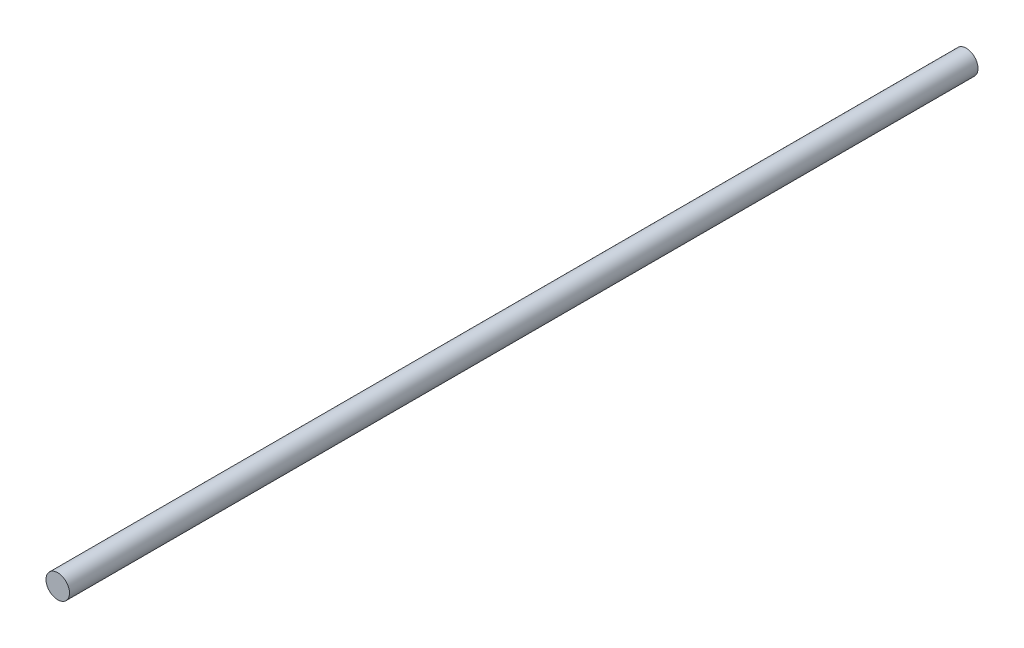
ISO-10303-21;
HEADER;
FILE_DESCRIPTION(('STEP AP214'),'2;1');
FILE_NAME('part.step','',(''),(''),'','','');
FILE_SCHEMA(('AUTOMOTIVE_DESIGN { 1 0 10303 214 1 1 1 1 }'));
ENDSEC;
DATA;
#1=APPLICATION_CONTEXT('core data for automotive mechanical design processes');
#2=APPLICATION_PROTOCOL_DEFINITION('international standard','automotive_design',2000,#1);
#3=PRODUCT_CONTEXT('',#1,'mechanical');
#4=PRODUCT('Part','Part','',(#3));
#5=PRODUCT_RELATED_PRODUCT_CATEGORY('part','',(#4));
#6=PRODUCT_DEFINITION_FORMATION('','',#4);
#7=PRODUCT_DEFINITION_CONTEXT('part definition',#1,'design');
#8=PRODUCT_DEFINITION('design','',#6,#7);
#9=PRODUCT_DEFINITION_SHAPE('','',#8);
#10=(LENGTH_UNIT() NAMED_UNIT(*) SI_UNIT(.MILLI.,.METRE.));
#11=(NAMED_UNIT(*) PLANE_ANGLE_UNIT() SI_UNIT($,.RADIAN.));
#12=(NAMED_UNIT(*) SI_UNIT($,.STERADIAN.) SOLID_ANGLE_UNIT());
#13=UNCERTAINTY_MEASURE_WITH_UNIT(LENGTH_MEASURE(1.E-05),#10,'distance_accuracy_value','');
#14=(GEOMETRIC_REPRESENTATION_CONTEXT(3) GLOBAL_UNCERTAINTY_ASSIGNED_CONTEXT((#13)) GLOBAL_UNIT_ASSIGNED_CONTEXT((#10,
#11,#12)) REPRESENTATION_CONTEXT('',''));
#15=CARTESIAN_POINT('',(0.,0.,0.));
#16=DIRECTION('',(0.,0.,1.));
#17=DIRECTION('',(1.,0.,0.));
#18=AXIS2_PLACEMENT_3D('',#15,#16,#17);
#19=CARTESIAN_POINT('',(0.,0.,232.));
#20=DIRECTION('',(0.,0.,-1.));
#21=DIRECTION('',(-1.,0.,0.));
#22=AXIS2_PLACEMENT_3D('',#19,#20,#21);
#23=CYLINDRICAL_SURFACE('',#22,3.);
#24=CARTESIAN_POINT('',(0.,0.,232.));
#25=DIRECTION('',(0.,0.,1.));
#26=DIRECTION('',(1.,0.,0.));
#27=AXIS2_PLACEMENT_3D('',#24,#25,#26);
#28=CIRCLE('',#27,3.);
#29=CARTESIAN_POINT('',(-3.,0.,232.));
#30=VERTEX_POINT('',#29);
#31=EDGE_CURVE('E10',#30,#30,#28,.T.);
#32=CARTESIAN_POINT('',(0.,0.,0.));
#33=DIRECTION('',(0.,0.,1.));
#34=DIRECTION('',(1.,0.,0.));
#35=AXIS2_PLACEMENT_3D('',#32,#33,#34);
#36=CIRCLE('',#35,3.);
#37=CARTESIAN_POINT('',(-3.,0.,0.));
#38=VERTEX_POINT('',#37);
#39=EDGE_CURVE('E36',#38,#38,#36,.T.);
#40=CARTESIAN_POINT('',(-3.,0.,232.));
#41=CARTESIAN_POINT('',(-3.,0.,229.583333333333));
#42=CARTESIAN_POINT('',(-3.,0.,227.166666666667));
#43=CARTESIAN_POINT('',(-3.,0.,222.333333333333));
#44=CARTESIAN_POINT('',(-3.,0.,219.916666666667));
#45=CARTESIAN_POINT('',(-3.,0.,215.083333333333));
#46=CARTESIAN_POINT('',(-3.,0.,212.666666666667));
#47=CARTESIAN_POINT('',(-3.,0.,207.833333333333));
#48=CARTESIAN_POINT('',(-3.,0.,205.416666666667));
#49=CARTESIAN_POINT('',(-3.,0.,200.583333333333));
#50=CARTESIAN_POINT('',(-3.,0.,198.166666666667));
#51=CARTESIAN_POINT('',(-3.,0.,193.333333333333));
#52=CARTESIAN_POINT('',(-3.,0.,190.916666666667));
#53=CARTESIAN_POINT('',(-3.,0.,186.083333333333));
#54=CARTESIAN_POINT('',(-3.,0.,183.666666666667));
#55=CARTESIAN_POINT('',(-3.,0.,178.833333333333));
#56=CARTESIAN_POINT('',(-3.,0.,176.416666666667));
#57=CARTESIAN_POINT('',(-3.,0.,171.583333333333));
#58=CARTESIAN_POINT('',(-3.,0.,169.166666666667));
#59=CARTESIAN_POINT('',(-3.,0.,164.333333333333));
#60=CARTESIAN_POINT('',(-3.,0.,161.916666666667));
#61=CARTESIAN_POINT('',(-3.,0.,157.083333333333));
#62=CARTESIAN_POINT('',(-3.,0.,154.666666666667));
#63=CARTESIAN_POINT('',(-3.,0.,149.833333333333));
#64=CARTESIAN_POINT('',(-3.,0.,147.416666666667));
#65=CARTESIAN_POINT('',(-3.,0.,142.583333333333));
#66=CARTESIAN_POINT('',(-3.,0.,140.166666666667));
#67=CARTESIAN_POINT('',(-3.,0.,135.333333333333));
#68=CARTESIAN_POINT('',(-3.,0.,132.916666666667));
#69=CARTESIAN_POINT('',(-3.,0.,128.083333333333));
#70=CARTESIAN_POINT('',(-3.,0.,125.666666666667));
#71=CARTESIAN_POINT('',(-3.,0.,120.833333333333));
#72=CARTESIAN_POINT('',(-3.,0.,118.416666666667));
#73=CARTESIAN_POINT('',(-3.,0.,113.583333333333));
#74=CARTESIAN_POINT('',(-3.,0.,111.166666666667));
#75=CARTESIAN_POINT('',(-3.,0.,106.333333333333));
#76=CARTESIAN_POINT('',(-3.,0.,103.916666666667));
#77=CARTESIAN_POINT('',(-3.,0.,99.0833333333333));
#78=CARTESIAN_POINT('',(-3.,0.,96.6666666666667));
#79=CARTESIAN_POINT('',(-3.,0.,91.8333333333334));
#80=CARTESIAN_POINT('',(-3.,0.,89.4166666666667));
#81=CARTESIAN_POINT('',(-3.,0.,84.5833333333334));
#82=CARTESIAN_POINT('',(-3.,0.,82.1666666666667));
#83=CARTESIAN_POINT('',(-3.,0.,77.3333333333334));
#84=CARTESIAN_POINT('',(-3.,0.,74.9166666666667));
#85=CARTESIAN_POINT('',(-3.,0.,70.0833333333333));
#86=CARTESIAN_POINT('',(-3.,0.,67.6666666666667));
#87=CARTESIAN_POINT('',(-3.,0.,62.8333333333333));
#88=CARTESIAN_POINT('',(-3.,0.,60.4166666666667));
#89=CARTESIAN_POINT('',(-3.,0.,55.5833333333333));
#90=CARTESIAN_POINT('',(-3.,0.,53.1666666666667));
#91=CARTESIAN_POINT('',(-3.,0.,48.3333333333333));
#92=CARTESIAN_POINT('',(-3.,0.,45.9166666666667));
#93=CARTESIAN_POINT('',(-3.,0.,41.0833333333333));
#94=CARTESIAN_POINT('',(-3.,0.,38.6666666666667));
#95=CARTESIAN_POINT('',(-3.,0.,33.8333333333333));
#96=CARTESIAN_POINT('',(-3.,0.,31.4166666666667));
#97=CARTESIAN_POINT('',(-3.,0.,26.5833333333333));
#98=CARTESIAN_POINT('',(-3.,0.,24.1666666666667));
#99=CARTESIAN_POINT('',(-3.,0.,19.3333333333333));
#100=CARTESIAN_POINT('',(-3.,0.,16.9166666666667));
#101=CARTESIAN_POINT('',(-3.,0.,12.0833333333333));
#102=CARTESIAN_POINT('',(-3.,0.,9.66666666666668));
#103=CARTESIAN_POINT('',(-3.,0.,4.83333333333334));
#104=CARTESIAN_POINT('',(-3.,0.,2.41666666666666));
#105=CARTESIAN_POINT('',(-3.,0.,0.));
#106=B_SPLINE_CURVE_WITH_KNOTS('',3,(#40,#41,#42,#43,#44,#45,#46,#47,#48,#49,#50,#51,#52,#53,
#54,#55,#56,#57,#58,#59,#60,#61,#62,#63,#64,#65,#66,#67,#68,#69,#70,#71,#72,#73,#74,#75,#76,#77,
#78,#79,#80,#81,#82,#83,#84,#85,#86,#87,#88,#89,#90,#91,#92,#93,#94,#95,#96,#97,#98,#99,#100,
#101,#102,#103,#104,#105),.UNSPECIFIED.,.F.,.F.,(4,2,2,2,2,2,2,2,2,2,2,2,2,2,2,2,2,2,2,2,2,2,2,
2,2,2,2,2,2,2,2,2,4),(0.,7.25000000000001,14.5,21.75,29.,36.25,43.5,50.75,58.,65.25,72.5,79.75,
87.,94.25,101.5,108.75,116.,123.25,130.5,137.75,145.,152.25,159.5,166.75,174.,181.25,188.5,
195.75,203.,210.25,217.5,224.75,232.),.UNSPECIFIED.);
#107=EDGE_CURVE('BSEAM33',#30,#38,#106,.T.);
#108=ORIENTED_EDGE('',*,*,#31,.F.);
#109=ORIENTED_EDGE('',*,*,#39,.T.);
#110=ORIENTED_EDGE('',*,*,#107,.T.);
#111=ORIENTED_EDGE('',*,*,#107,.F.);
#112=EDGE_LOOP('',(#108,#110,#109,#111));
#113=FACE_BOUND('',#112,.T.);
#114=ADVANCED_FACE('F33',(#113),#23,.T.);
#115=CARTESIAN_POINT('',(0.,0.,232.));
#116=DIRECTION('',(0.,0.,1.));
#117=DIRECTION('',(1.,0.,0.));
#118=AXIS2_PLACEMENT_3D('',#115,#116,#117);
#119=PLANE('',#118);
#120=ORIENTED_EDGE('',*,*,#31,.T.);
#121=EDGE_LOOP('',(#120));
#122=FACE_BOUND('',#121,.T.);
#123=ADVANCED_FACE('F48',(#122),#119,.T.);
#124=CARTESIAN_POINT('',(0.,0.,0.));
#125=DIRECTION('',(0.,0.,1.));
#126=DIRECTION('',(1.,0.,0.));
#127=AXIS2_PLACEMENT_3D('',#124,#125,#126);
#128=PLANE('',#127);
#129=ORIENTED_EDGE('',*,*,#39,.F.);
#130=EDGE_LOOP('',(#129));
#131=FACE_BOUND('',#130,.T.);
#132=ADVANCED_FACE('F46',(#131),#128,.F.);
#133=CLOSED_SHELL('',(#114,#123,#132));
#134=MANIFOLD_SOLID_BREP('B2',#133);
#135=ADVANCED_BREP_SHAPE_REPRESENTATION('',(#18,#134),#14);
#136=SHAPE_DEFINITION_REPRESENTATION(#9,#135);
ENDSEC;
END-ISO-10303-21;
